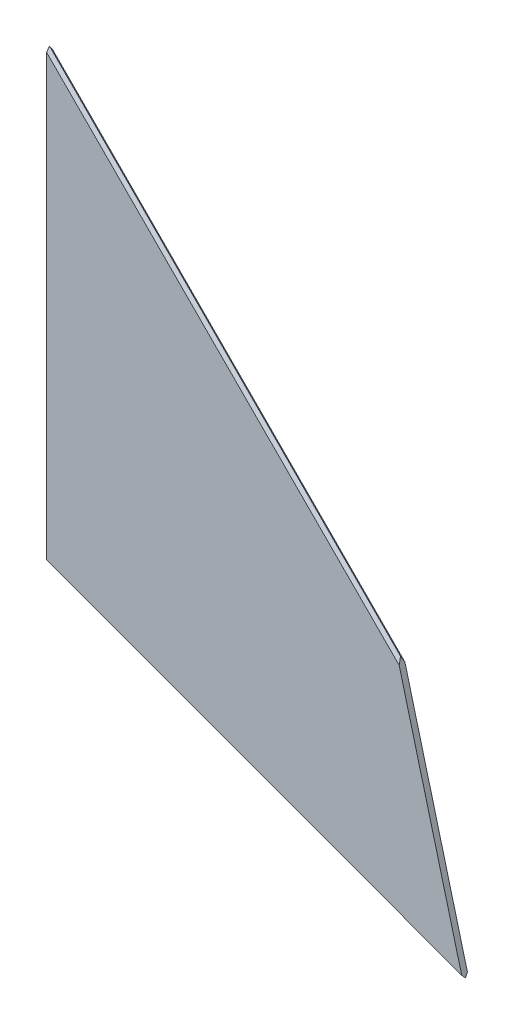
ISO-10303-21;
HEADER;
FILE_DESCRIPTION(('STEP AP214'),'2;1');
FILE_NAME('part.step','',(''),(''),'','','');
FILE_SCHEMA(('AUTOMOTIVE_DESIGN { 1 0 10303 214 1 1 1 1 }'));
ENDSEC;
DATA;
#1=APPLICATION_CONTEXT('core data for automotive mechanical design processes');
#2=APPLICATION_PROTOCOL_DEFINITION('international standard','automotive_design',2000,#1);
#3=PRODUCT_CONTEXT('',#1,'mechanical');
#4=PRODUCT('Part','Part','',(#3));
#5=PRODUCT_RELATED_PRODUCT_CATEGORY('part','',(#4));
#6=PRODUCT_DEFINITION_FORMATION('','',#4);
#7=PRODUCT_DEFINITION_CONTEXT('part definition',#1,'design');
#8=PRODUCT_DEFINITION('design','',#6,#7);
#9=PRODUCT_DEFINITION_SHAPE('','',#8);
#10=(LENGTH_UNIT() NAMED_UNIT(*) SI_UNIT(.MILLI.,.METRE.));
#11=(NAMED_UNIT(*) PLANE_ANGLE_UNIT() SI_UNIT($,.RADIAN.));
#12=(NAMED_UNIT(*) SI_UNIT($,.STERADIAN.) SOLID_ANGLE_UNIT());
#13=UNCERTAINTY_MEASURE_WITH_UNIT(LENGTH_MEASURE(1.E-05),#10,'distance_accuracy_value','');
#14=(GEOMETRIC_REPRESENTATION_CONTEXT(3) GLOBAL_UNCERTAINTY_ASSIGNED_CONTEXT((#13)) GLOBAL_UNIT_ASSIGNED_CONTEXT((#10,
#11,#12)) REPRESENTATION_CONTEXT('',''));
#15=CARTESIAN_POINT('',(0.,0.,0.));
#16=DIRECTION('',(0.,0.,1.));
#17=DIRECTION('',(1.,0.,0.));
#18=AXIS2_PLACEMENT_3D('',#15,#16,#17);
#19=CARTESIAN_POINT('',(184.,49.,1.5));
#20=DIRECTION('',(-0.966977369095331,-0.254862252319701,0.));
#21=DIRECTION('',(0.254862252319701,-0.966977369095332,0.));
#22=AXIS2_PLACEMENT_3D('',#19,#20,#21);
#23=PLANE('',#22);
#24=DIRECTION('',(-0.254862252319701,0.966977369095332,0.));
#25=VECTOR('',#24,1.);
#26=CARTESIAN_POINT('',(184.,49.,-1.5));
#27=LINE('',#26,#25);
#28=CARTESIAN_POINT('',(217.533777408125,-78.2310966367098,-1.5));
#29=VERTEX_POINT('',#28);
#30=CARTESIAN_POINT('',(184.762758877689,46.1060030817093,-1.5));
#31=VERTEX_POINT('',#30);
#32=EDGE_CURVE('E124',#29,#31,#27,.T.);
#33=ORIENTED_EDGE('',*,*,#32,.T.);
#34=DIRECTION('',(0.2278464213415,-0.864476128030981,-0.448070343078443));
#35=VECTOR('',#34,1.);
#36=CARTESIAN_POINT('',(138.008783984066,223.496084295747,90.4438165740052));
#37=LINE('',#36,#35);
#38=CARTESIAN_POINT('',(184.,49.,0.));
#39=VERTEX_POINT('',#38);
#40=EDGE_CURVE('E127',#31,#39,#37,.F.);
#41=ORIENTED_EDGE('',*,*,#40,.T.);
#42=DIRECTION('',(0.2278464213415,-0.864476128030981,0.448070343078443));
#43=VECTOR('',#42,1.);
#44=CARTESIAN_POINT('',(167.55904263523,111.378926472214,-32.3318898914327));
#45=LINE('',#44,#43);
#46=CARTESIAN_POINT('',(184.762758877689,46.1060030817094,1.5));
#47=VERTEX_POINT('',#46);
#48=EDGE_CURVE('E69',#39,#47,#45,.T.);
#49=ORIENTED_EDGE('',*,*,#48,.T.);
#50=DIRECTION('',(-0.254862252319701,0.966977369095332,0.));
#51=VECTOR('',#50,1.);
#52=CARTESIAN_POINT('',(184.,49.,1.5));
#53=LINE('',#52,#51);
#54=CARTESIAN_POINT('',(217.533777408125,-78.2310966367099,1.5));
#55=VERTEX_POINT('',#54);
#56=EDGE_CURVE('E123',#55,#47,#53,.T.);
#57=ORIENTED_EDGE('',*,*,#56,.F.);
#58=DIRECTION('',(0.197078666516042,-0.747739646487331,-0.63407051680019));
#59=VECTOR('',#58,1.);
#60=CARTESIAN_POINT('',(197.368911916272,-1.72322462350322,66.3773756675728));
#61=LINE('',#60,#59);
#62=CARTESIAN_POINT('',(218.,-80.,0.));
#63=VERTEX_POINT('',#62);
#64=EDGE_CURVE('E63',#55,#63,#61,.T.);
#65=ORIENTED_EDGE('',*,*,#64,.T.);
#66=DIRECTION('',(0.197078666516039,-0.74773964648732,0.634070516800204));
#67=VECTOR('',#66,1.);
#68=CARTESIAN_POINT('',(197.743797232057,-3.14558361574617,-65.1712394067474));
#69=LINE('',#68,#67);
#70=EDGE_CURVE('E133',#63,#29,#69,.F.);
#71=ORIENTED_EDGE('',*,*,#70,.T.);
#72=EDGE_LOOP('',(#33,#41,#49,#57,#65,#71));
#73=FACE_BOUND('',#72,.T.);
#74=ADVANCED_FACE('F44',(#73),#23,.F.);
#75=CARTESIAN_POINT('',(0.,0.,1.5));
#76=DIRECTION('',(1.,0.,0.));
#77=DIRECTION('',(0.,1.,0.));
#78=AXIS2_PLACEMENT_3D('',#75,#76,#77);
#79=PLANE('',#78);
#80=DIRECTION('',(0.,0.817235152382477,-0.576304351632355));
#81=VECTOR('',#80,1.);
#82=CARTESIAN_POINT('',(-5.41233724504764E-13,154.022369748587,56.3992581728316));
#83=LINE('',#82,#81);
#84=CARTESIAN_POINT('',(-7.97594933386935E-13,231.872907388081,1.5));
#85=VERTEX_POINT('',#84);
#86=CARTESIAN_POINT('',(-8.04911692853238E-13,234.,0.));
#87=VERTEX_POINT('',#86);
#88=EDGE_CURVE('E106',#85,#87,#83,.T.);
#89=ORIENTED_EDGE('',*,*,#88,.T.);
#90=DIRECTION('',(0.,0.817235152382477,0.576304351632355));
#91=VECTOR('',#90,1.);
#92=CARTESIAN_POINT('',(-8.04911692853238E-13,234.,0.));
#93=LINE('',#92,#91);
#94=CARTESIAN_POINT('',(-7.97594933386935E-13,231.872907388081,-1.5));
#95=VERTEX_POINT('',#94);
#96=EDGE_CURVE('E100',#87,#95,#93,.F.);
#97=ORIENTED_EDGE('',*,*,#96,.T.);
#98=DIRECTION('',(0.,-1.,0.));
#99=VECTOR('',#98,1.);
#100=CARTESIAN_POINT('',(0.,0.,-1.5));
#101=LINE('',#100,#99);
#102=CARTESIAN_POINT('',(0.,1.59781250388654,-1.5));
#103=VERTEX_POINT('',#102);
#104=EDGE_CURVE('E103',#95,#103,#101,.T.);
#105=ORIENTED_EDGE('',*,*,#104,.T.);
#106=DIRECTION('',(0.,0.729070129470834,-0.684439001163275));
#107=VECTOR('',#106,1.);
#108=CARTESIAN_POINT('',(0.,0.,0.));
#109=LINE('',#108,#107);
#110=CARTESIAN_POINT('',(0.,0.,0.));
#111=VERTEX_POINT('',#110);
#112=EDGE_CURVE('E156',#103,#111,#109,.F.);
#113=ORIENTED_EDGE('',*,*,#112,.T.);
#114=DIRECTION('',(0.,0.729070129470846,0.684439001163262));
#115=VECTOR('',#114,1.);
#116=CARTESIAN_POINT('',(0.,1.49701209357904,1.40537023894014));
#117=LINE('',#116,#115);
#118=CARTESIAN_POINT('',(0.,1.59781250388651,1.5));
#119=VERTEX_POINT('',#118);
#120=EDGE_CURVE('E160',#111,#119,#117,.T.);
#121=ORIENTED_EDGE('',*,*,#120,.T.);
#122=DIRECTION('',(0.,-1.,0.));
#123=VECTOR('',#122,1.);
#124=CARTESIAN_POINT('',(0.,0.,1.5));
#125=LINE('',#124,#123);
#126=EDGE_CURVE('E163',#85,#119,#125,.T.);
#127=ORIENTED_EDGE('',*,*,#126,.F.);
#128=EDGE_LOOP('',(#89,#97,#105,#113,#121,#127));
#129=FACE_BOUND('',#128,.T.);
#130=ADVANCED_FACE('F102',(#129),#79,.F.);
#131=CARTESIAN_POINT('',(0.,0.,1.5));
#132=DIRECTION('',(0.,0.,1.));
#133=DIRECTION('',(1.,0.,0.));
#134=AXIS2_PLACEMENT_3D('',#131,#132,#133);
#135=PLANE('',#134);
#136=ORIENTED_EDGE('',*,*,#56,.T.);
#137=DIRECTION('',(-0.705187913114436,0.70902045612049,0.));
#138=VECTOR('',#137,1.);
#139=CARTESIAN_POINT('',(-1.06353068418154,232.942218130328,1.5));
#140=LINE('',#139,#138);
#141=EDGE_CURVE('E11',#47,#85,#140,.T.);
#142=ORIENTED_EDGE('',*,*,#141,.T.);
#143=ORIENTED_EDGE('',*,*,#126,.T.);
#144=DIRECTION('',(0.938783490773444,-0.344507703036126,0.));
#145=VECTOR('',#144,1.);
#146=CARTESIAN_POINT('',(218.516761554554,-78.5918247638398,1.5));
#147=LINE('',#146,#145);
#148=EDGE_CURVE('E55',#119,#55,#147,.T.);
#149=ORIENTED_EDGE('',*,*,#148,.T.);
#150=EDGE_LOOP('',(#136,#142,#143,#149));
#151=FACE_BOUND('',#150,.T.);
#152=ADVANCED_FACE('F180',(#151),#135,.T.);
#153=CARTESIAN_POINT('',(0.,0.,-1.5));
#154=DIRECTION('',(0.,0.,1.));
#155=DIRECTION('',(1.,0.,0.));
#156=AXIS2_PLACEMENT_3D('',#153,#154,#155);
#157=PLANE('',#156);
#158=ORIENTED_EDGE('',*,*,#104,.F.);
#159=DIRECTION('',(0.705187913114436,-0.70902045612049,0.));
#160=VECTOR('',#159,1.);
#161=CARTESIAN_POINT('',(115.934750774669,115.308076446158,-1.5));
#162=LINE('',#161,#160);
#163=EDGE_CURVE('E119',#95,#31,#162,.T.);
#164=ORIENTED_EDGE('',*,*,#163,.T.);
#165=ORIENTED_EDGE('',*,*,#32,.F.);
#166=DIRECTION('',(-0.938783490773444,0.344507703036126,0.));
#167=VECTOR('',#166,1.);
#168=CARTESIAN_POINT('',(0.516761554554208,1.40817523616022,-1.5));
#169=LINE('',#168,#167);
#170=EDGE_CURVE('E112',#29,#103,#169,.T.);
#171=ORIENTED_EDGE('',*,*,#170,.T.);
#172=EDGE_LOOP('',(#158,#164,#165,#171));
#173=FACE_BOUND('',#172,.T.);
#174=ADVANCED_FACE('F117',(#173),#157,.F.);
#175=CARTESIAN_POINT('',(115.934750774669,115.308076446158,1.5));
#176=DIRECTION('',(0.501353172522777,0.498643155374007,0.707106781186547));
#177=DIRECTION('',(0.705187913114436,-0.70902045612049,0.));
#178=AXIS2_PLACEMENT_3D('',#175,#176,#177);
#179=PLANE('',#178);
#180=ORIENTED_EDGE('',*,*,#141,.F.);
#181=ORIENTED_EDGE('',*,*,#48,.F.);
#182=DIRECTION('',(0.705187913114436,-0.70902045612049,0.));
#183=VECTOR('',#182,1.);
#184=CARTESIAN_POINT('',(184.,49.,0.));
#185=LINE('',#184,#183);
#186=EDGE_CURVE('E144',#87,#39,#185,.T.);
#187=ORIENTED_EDGE('',*,*,#186,.F.);
#188=ORIENTED_EDGE('',*,*,#88,.F.);
#189=EDGE_LOOP('',(#180,#181,#187,#188));
#190=FACE_BOUND('',#189,.T.);
#191=ADVANCED_FACE('F182',(#190),#179,.T.);
#192=CARTESIAN_POINT('',(-8.04911692853238E-13,234.,0.));
#193=DIRECTION('',(-0.501353172522777,-0.498643155374007,0.707106781186547));
#194=DIRECTION('',(-0.705187913114436,0.70902045612049,0.));
#195=AXIS2_PLACEMENT_3D('',#192,#193,#194);
#196=PLANE('',#195);
#197=ORIENTED_EDGE('',*,*,#40,.F.);
#198=ORIENTED_EDGE('',*,*,#163,.F.);
#199=ORIENTED_EDGE('',*,*,#96,.F.);
#200=ORIENTED_EDGE('',*,*,#186,.T.);
#201=EDGE_LOOP('',(#197,#198,#199,#200));
#202=FACE_BOUND('',#201,.T.);
#203=ADVANCED_FACE('F126',(#202),#196,.F.);
#204=CARTESIAN_POINT('',(0.516761554554208,1.40817523616022,1.5));
#205=DIRECTION('',(-0.243603732987841,-0.663820172391868,0.70710678118656));
#206=DIRECTION('',(-0.938783490773444,0.344507703036126,0.));
#207=AXIS2_PLACEMENT_3D('',#204,#205,#206);
#208=PLANE('',#207);
#209=ORIENTED_EDGE('',*,*,#148,.F.);
#210=ORIENTED_EDGE('',*,*,#120,.F.);
#211=DIRECTION('',(-0.938783490773444,0.344507703036126,0.));
#212=VECTOR('',#211,1.);
#213=CARTESIAN_POINT('',(0.,0.,0.));
#214=LINE('',#213,#212);
#215=EDGE_CURVE('E49',#63,#111,#214,.T.);
#216=ORIENTED_EDGE('',*,*,#215,.F.);
#217=ORIENTED_EDGE('',*,*,#64,.F.);
#218=EDGE_LOOP('',(#209,#210,#216,#217));
#219=FACE_BOUND('',#218,.T.);
#220=ADVANCED_FACE('F47',(#219),#208,.T.);
#221=CARTESIAN_POINT('',(0.,0.,0.));
#222=DIRECTION('',(0.243603732987846,0.663820172391881,0.707106781186548));
#223=DIRECTION('',(0.938783490773444,-0.344507703036126,0.));
#224=AXIS2_PLACEMENT_3D('',#221,#222,#223);
#225=PLANE('',#224);
#226=ORIENTED_EDGE('',*,*,#112,.F.);
#227=ORIENTED_EDGE('',*,*,#170,.F.);
#228=ORIENTED_EDGE('',*,*,#70,.F.);
#229=ORIENTED_EDGE('',*,*,#215,.T.);
#230=EDGE_LOOP('',(#226,#227,#228,#229));
#231=FACE_BOUND('',#230,.T.);
#232=ADVANCED_FACE('F155',(#231),#225,.F.);
#233=CLOSED_SHELL('',(#74,#130,#152,#174,#191,#203,#220,#232));
#234=MANIFOLD_SOLID_BREP('B2',#233);
#235=ADVANCED_BREP_SHAPE_REPRESENTATION('',(#18,#234),#14);
#236=SHAPE_DEFINITION_REPRESENTATION(#9,#235);
ENDSEC;
END-ISO-10303-21;
